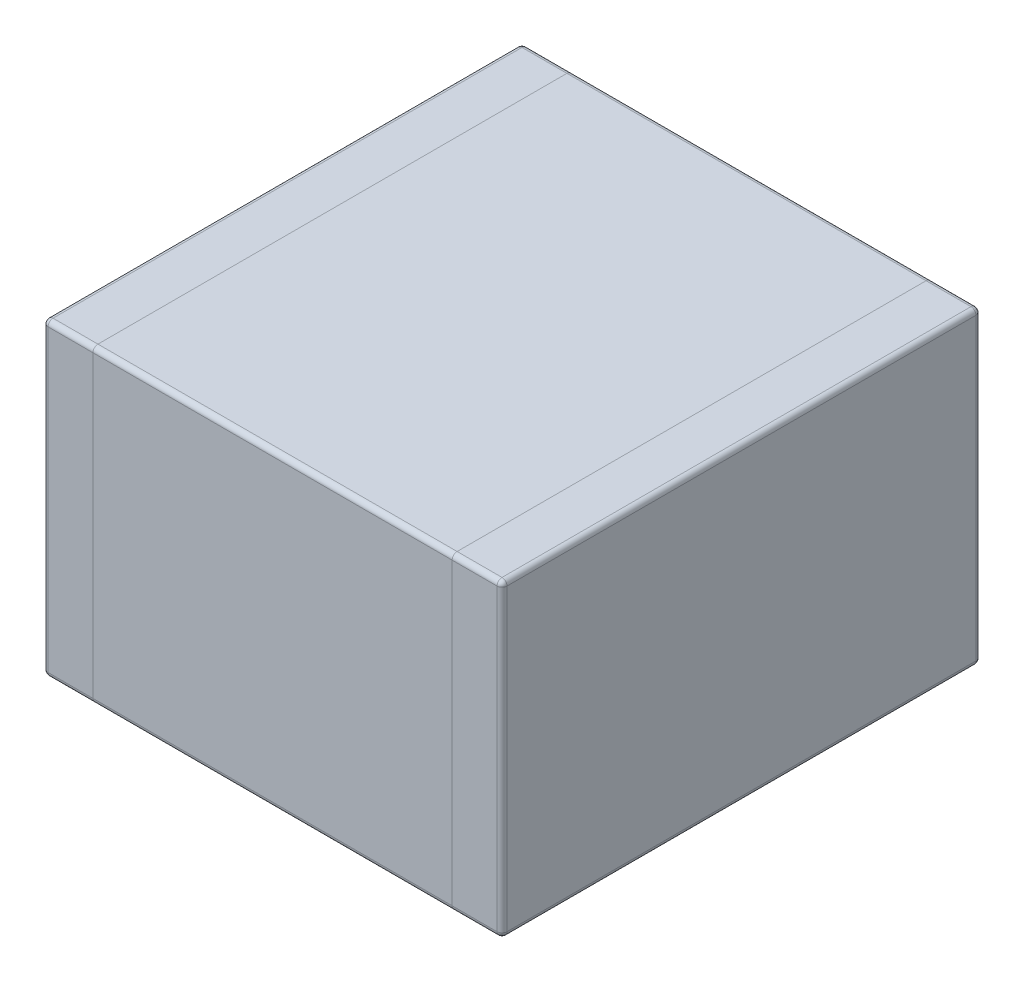
ISO-10303-21;
HEADER;
FILE_DESCRIPTION(('STEP AP214'),'2;1');
FILE_NAME('part.step','',(''),(''),'','','');
FILE_SCHEMA(('AUTOMOTIVE_DESIGN { 1 0 10303 214 1 1 1 1 }'));
ENDSEC;
DATA;
#1=APPLICATION_CONTEXT('core data for automotive mechanical design processes');
#2=APPLICATION_PROTOCOL_DEFINITION('international standard','automotive_design',2000,#1);
#3=PRODUCT_CONTEXT('',#1,'mechanical');
#4=PRODUCT('Part','Part','',(#3));
#5=PRODUCT_RELATED_PRODUCT_CATEGORY('part','',(#4));
#6=PRODUCT_DEFINITION_FORMATION('','',#4);
#7=PRODUCT_DEFINITION_CONTEXT('part definition',#1,'design');
#8=PRODUCT_DEFINITION('design','',#6,#7);
#9=PRODUCT_DEFINITION_SHAPE('','',#8);
#10=(LENGTH_UNIT() NAMED_UNIT(*) SI_UNIT(.MILLI.,.METRE.));
#11=(NAMED_UNIT(*) PLANE_ANGLE_UNIT() SI_UNIT($,.RADIAN.));
#12=(NAMED_UNIT(*) SI_UNIT($,.STERADIAN.) SOLID_ANGLE_UNIT());
#13=UNCERTAINTY_MEASURE_WITH_UNIT(LENGTH_MEASURE(1.E-05),#10,'distance_accuracy_value','');
#14=(GEOMETRIC_REPRESENTATION_CONTEXT(3) GLOBAL_UNCERTAINTY_ASSIGNED_CONTEXT((#13)) GLOBAL_UNIT_ASSIGNED_CONTEXT((#10,
#11,#12)) REPRESENTATION_CONTEXT('',''));
#15=CARTESIAN_POINT('',(0.,0.,0.));
#16=DIRECTION('',(0.,0.,1.));
#17=DIRECTION('',(1.,0.,0.));
#18=AXIS2_PLACEMENT_3D('',#15,#16,#17);
#19=CARTESIAN_POINT('',(2.3,3.1,-2.4));
#20=DIRECTION('',(0.,-1.,0.));
#21=DIRECTION('',(0.,0.,-1.));
#22=AXIS2_PLACEMENT_3D('',#19,#20,#21);
#23=PLANE('',#22);
#24=DIRECTION('',(0.,0.,1.));
#25=VECTOR('',#24,1.);
#26=CARTESIAN_POINT('',(-1.8,3.1,-2.4));
#27=LINE('',#26,#25);
#28=CARTESIAN_POINT('',(-1.8,3.1,-2.35));
#29=VERTEX_POINT('',#28);
#30=CARTESIAN_POINT('',(-1.8,3.1,2.35));
#31=VERTEX_POINT('',#30);
#32=EDGE_CURVE('E11',#29,#31,#27,.T.);
#33=ORIENTED_EDGE('',*,*,#32,.F.);
#34=DIRECTION('',(-1.,0.,0.));
#35=VECTOR('',#34,1.);
#36=CARTESIAN_POINT('',(2.3,3.1,-2.35));
#37=LINE('',#36,#35);
#38=CARTESIAN_POINT('',(-2.25,3.1,-2.35));
#39=VERTEX_POINT('',#38);
#40=EDGE_CURVE('E253',#29,#39,#37,.T.);
#41=ORIENTED_EDGE('',*,*,#40,.T.);
#42=DIRECTION('',(0.,0.,1.));
#43=VECTOR('',#42,1.);
#44=CARTESIAN_POINT('',(-2.25,3.1,-2.4));
#45=LINE('',#44,#43);
#46=CARTESIAN_POINT('',(-2.25,3.1,2.35));
#47=VERTEX_POINT('',#46);
#48=EDGE_CURVE('E256',#39,#47,#45,.T.);
#49=ORIENTED_EDGE('',*,*,#48,.T.);
#50=DIRECTION('',(1.,0.,0.));
#51=VECTOR('',#50,1.);
#52=CARTESIAN_POINT('',(2.3,3.1,2.35));
#53=LINE('',#52,#51);
#54=EDGE_CURVE('E260',#47,#31,#53,.T.);
#55=ORIENTED_EDGE('',*,*,#54,.T.);
#56=EDGE_LOOP('',(#33,#41,#49,#55));
#57=FACE_BOUND('',#56,.T.);
#58=ADVANCED_FACE('F37',(#57),#23,.F.);
#59=DIRECTION('',(0.,0.,-1.));
#60=VECTOR('',#59,1.);
#61=CARTESIAN_POINT('',(1.8,3.1,-2.4));
#62=LINE('',#61,#60);
#63=CARTESIAN_POINT('',(1.8,3.1,2.35));
#64=VERTEX_POINT('',#63);
#65=CARTESIAN_POINT('',(1.8,3.1,-2.35));
#66=VERTEX_POINT('',#65);
#67=EDGE_CURVE('E47',#64,#66,#62,.T.);
#68=ORIENTED_EDGE('',*,*,#67,.F.);
#69=CARTESIAN_POINT('',(2.25,3.1,2.35));
#70=VERTEX_POINT('',#69);
#71=EDGE_CURVE('E259',#64,#70,#53,.T.);
#72=ORIENTED_EDGE('',*,*,#71,.T.);
#73=DIRECTION('',(0.,0.,-1.));
#74=VECTOR('',#73,1.);
#75=CARTESIAN_POINT('',(2.25,3.1,-2.4));
#76=LINE('',#75,#74);
#77=CARTESIAN_POINT('',(2.25,3.1,-2.35));
#78=VERTEX_POINT('',#77);
#79=EDGE_CURVE('E250',#70,#78,#76,.T.);
#80=ORIENTED_EDGE('',*,*,#79,.T.);
#81=EDGE_CURVE('E254',#78,#66,#37,.T.);
#82=ORIENTED_EDGE('',*,*,#81,.T.);
#83=EDGE_LOOP('',(#68,#72,#80,#82));
#84=FACE_BOUND('',#83,.T.);
#85=ADVANCED_FACE('F526',(#84),#23,.F.);
#86=CARTESIAN_POINT('',(2.3,3.05,2.35));
#87=DIRECTION('',(1.,0.,0.));
#88=DIRECTION('',(0.,0.,-1.));
#89=AXIS2_PLACEMENT_3D('',#86,#87,#88);
#90=CYLINDRICAL_SURFACE('',#89,0.05);
#91=DIRECTION('',(1.,0.,0.));
#92=VECTOR('',#91,1.);
#93=CARTESIAN_POINT('',(-2.3,3.05,2.4));
#94=LINE('',#93,#92);
#95=CARTESIAN_POINT('',(-1.8,3.05,2.4));
#96=VERTEX_POINT('',#95);
#97=CARTESIAN_POINT('',(-2.25,3.05,2.4));
#98=VERTEX_POINT('',#97);
#99=EDGE_CURVE('E246',#96,#98,#94,.F.);
#100=ORIENTED_EDGE('',*,*,#99,.F.);
#101=CARTESIAN_POINT('',(-1.8,3.05,2.35));
#102=DIRECTION('',(1.,0.,0.));
#103=DIRECTION('',(0.,0.,-1.));
#104=AXIS2_PLACEMENT_3D('',#101,#102,#103);
#105=CIRCLE('',#104,0.05);
#106=EDGE_CURVE('E354',#96,#31,#105,.F.);
#107=ORIENTED_EDGE('',*,*,#106,.T.);
#108=ORIENTED_EDGE('',*,*,#54,.F.);
#109=CARTESIAN_POINT('',(-2.25,3.05,2.35));
#110=DIRECTION('',(-1.,0.,0.));
#111=DIRECTION('',(0.,-1.,0.));
#112=AXIS2_PLACEMENT_3D('',#109,#110,#111);
#113=CIRCLE('',#112,0.05);
#114=EDGE_CURVE('E330',#47,#98,#113,.F.);
#115=ORIENTED_EDGE('',*,*,#114,.T.);
#116=EDGE_LOOP('',(#100,#107,#108,#115));
#117=FACE_BOUND('',#116,.T.);
#118=ADVANCED_FACE('F483',(#117),#90,.T.);
#119=ORIENTED_EDGE('',*,*,#71,.F.);
#120=CARTESIAN_POINT('',(1.8,3.05,2.35));
#121=DIRECTION('',(-1.,0.,0.));
#122=DIRECTION('',(0.,0.,1.));
#123=AXIS2_PLACEMENT_3D('',#120,#121,#122);
#124=CIRCLE('',#123,0.05);
#125=CARTESIAN_POINT('',(1.8,3.05,2.4));
#126=VERTEX_POINT('',#125);
#127=EDGE_CURVE('E353',#64,#126,#124,.F.);
#128=ORIENTED_EDGE('',*,*,#127,.T.);
#129=CARTESIAN_POINT('',(2.25,3.05,2.4));
#130=VERTEX_POINT('',#129);
#131=EDGE_CURVE('E247',#130,#126,#94,.F.);
#132=ORIENTED_EDGE('',*,*,#131,.F.);
#133=CARTESIAN_POINT('',(2.25,3.05,2.35));
#134=DIRECTION('',(1.,0.,0.));
#135=DIRECTION('',(0.,0.,-1.));
#136=AXIS2_PLACEMENT_3D('',#133,#134,#135);
#137=CIRCLE('',#136,0.05);
#138=EDGE_CURVE('E315',#70,#130,#137,.T.);
#139=ORIENTED_EDGE('',*,*,#138,.F.);
#140=EDGE_LOOP('',(#119,#128,#132,#139));
#141=FACE_BOUND('',#140,.T.);
#142=ADVANCED_FACE('F457',(#141),#90,.T.);
#143=CARTESIAN_POINT('',(-2.3,3.1,2.4));
#144=DIRECTION('',(0.,0.,-1.));
#145=DIRECTION('',(-1.,0.,0.));
#146=AXIS2_PLACEMENT_3D('',#143,#144,#145);
#147=PLANE('',#146);
#148=DIRECTION('',(0.,-1.,0.));
#149=VECTOR('',#148,1.);
#150=CARTESIAN_POINT('',(-1.8,3.1,2.4));
#151=LINE('',#150,#149);
#152=CARTESIAN_POINT('',(-1.8,0.0500000000000001,2.4));
#153=VERTEX_POINT('',#152);
#154=EDGE_CURVE('E349',#96,#153,#151,.T.);
#155=ORIENTED_EDGE('',*,*,#154,.F.);
#156=ORIENTED_EDGE('',*,*,#99,.T.);
#157=DIRECTION('',(0.,-1.,0.));
#158=VECTOR('',#157,1.);
#159=CARTESIAN_POINT('',(-2.25,3.1,2.4));
#160=LINE('',#159,#158);
#161=CARTESIAN_POINT('',(-2.25,0.0500000000000001,2.4));
#162=VERTEX_POINT('',#161);
#163=EDGE_CURVE('E243',#98,#162,#160,.T.);
#164=ORIENTED_EDGE('',*,*,#163,.T.);
#165=DIRECTION('',(1.,0.,0.));
#166=VECTOR('',#165,1.);
#167=CARTESIAN_POINT('',(2.3,0.0500000000000001,2.4));
#168=LINE('',#167,#166);
#169=EDGE_CURVE('E237',#162,#153,#168,.T.);
#170=ORIENTED_EDGE('',*,*,#169,.T.);
#171=EDGE_LOOP('',(#155,#156,#164,#170));
#172=FACE_BOUND('',#171,.T.);
#173=ADVANCED_FACE('F471',(#172),#147,.F.);
#174=DIRECTION('',(0.,1.,0.));
#175=VECTOR('',#174,1.);
#176=CARTESIAN_POINT('',(1.8,3.1,2.4));
#177=LINE('',#176,#175);
#178=CARTESIAN_POINT('',(1.8,0.0500000000000001,2.4));
#179=VERTEX_POINT('',#178);
#180=EDGE_CURVE('E345',#179,#126,#177,.T.);
#181=ORIENTED_EDGE('',*,*,#180,.F.);
#182=CARTESIAN_POINT('',(2.25,0.0500000000000001,2.4));
#183=VERTEX_POINT('',#182);
#184=EDGE_CURVE('E236',#179,#183,#168,.T.);
#185=ORIENTED_EDGE('',*,*,#184,.T.);
#186=DIRECTION('',(0.,-1.,0.));
#187=VECTOR('',#186,1.);
#188=CARTESIAN_POINT('',(2.25,3.1,2.4));
#189=LINE('',#188,#187);
#190=EDGE_CURVE('E240',#183,#130,#189,.F.);
#191=ORIENTED_EDGE('',*,*,#190,.T.);
#192=ORIENTED_EDGE('',*,*,#131,.T.);
#193=EDGE_LOOP('',(#181,#185,#191,#192));
#194=FACE_BOUND('',#193,.T.);
#195=ADVANCED_FACE('F453',(#194),#147,.F.);
#196=CARTESIAN_POINT('',(-2.3,0.0500000000000001,2.35));
#197=DIRECTION('',(-1.,0.,0.));
#198=DIRECTION('',(0.,0.,1.));
#199=AXIS2_PLACEMENT_3D('',#196,#197,#198);
#200=CYLINDRICAL_SURFACE('',#199,0.05);
#201=DIRECTION('',(1.,0.,0.));
#202=VECTOR('',#201,1.);
#203=CARTESIAN_POINT('',(-2.3,0.,2.35));
#204=LINE('',#203,#202);
#205=CARTESIAN_POINT('',(-1.8,0.,2.35));
#206=VERTEX_POINT('',#205);
#207=CARTESIAN_POINT('',(-2.25,0.,2.35));
#208=VERTEX_POINT('',#207);
#209=EDGE_CURVE('E266',#206,#208,#204,.F.);
#210=ORIENTED_EDGE('',*,*,#209,.F.);
#211=CARTESIAN_POINT('',(-1.8,0.0500000000000001,2.35));
#212=DIRECTION('',(1.,0.,0.));
#213=DIRECTION('',(0.,0.,-1.));
#214=AXIS2_PLACEMENT_3D('',#211,#212,#213);
#215=CIRCLE('',#214,0.05);
#216=EDGE_CURVE('E350',#206,#153,#215,.F.);
#217=ORIENTED_EDGE('',*,*,#216,.T.);
#218=ORIENTED_EDGE('',*,*,#169,.F.);
#219=CARTESIAN_POINT('',(-2.25,0.05,2.35));
#220=DIRECTION('',(-1.,0.,0.));
#221=DIRECTION('',(0.,0.,1.));
#222=AXIS2_PLACEMENT_3D('',#219,#220,#221);
#223=CIRCLE('',#222,0.05);
#224=EDGE_CURVE('E321',#162,#208,#223,.F.);
#225=ORIENTED_EDGE('',*,*,#224,.T.);
#226=EDGE_LOOP('',(#210,#217,#218,#225));
#227=FACE_BOUND('',#226,.T.);
#228=ADVANCED_FACE('F509',(#227),#200,.T.);
#229=ORIENTED_EDGE('',*,*,#184,.F.);
#230=CARTESIAN_POINT('',(1.8,0.0500000000000001,2.35));
#231=DIRECTION('',(-1.,0.,0.));
#232=DIRECTION('',(0.,0.,1.));
#233=AXIS2_PLACEMENT_3D('',#230,#231,#232);
#234=CIRCLE('',#233,0.05);
#235=CARTESIAN_POINT('',(1.8,0.,2.35));
#236=VERTEX_POINT('',#235);
#237=EDGE_CURVE('E365',#179,#236,#234,.F.);
#238=ORIENTED_EDGE('',*,*,#237,.T.);
#239=CARTESIAN_POINT('',(2.25,0.,2.35));
#240=VERTEX_POINT('',#239);
#241=EDGE_CURVE('E267',#240,#236,#204,.F.);
#242=ORIENTED_EDGE('',*,*,#241,.F.);
#243=CARTESIAN_POINT('',(2.25,0.0500000000000001,2.35));
#244=DIRECTION('',(1.,0.,0.));
#245=DIRECTION('',(0.,0.,-1.));
#246=AXIS2_PLACEMENT_3D('',#243,#244,#245);
#247=CIRCLE('',#246,0.05);
#248=EDGE_CURVE('E301',#183,#240,#247,.T.);
#249=ORIENTED_EDGE('',*,*,#248,.F.);
#250=EDGE_LOOP('',(#229,#238,#242,#249));
#251=FACE_BOUND('',#250,.T.);
#252=ADVANCED_FACE('F443',(#251),#200,.T.);
#253=CARTESIAN_POINT('',(2.3,0.,-2.4));
#254=DIRECTION('',(0.,-1.,0.));
#255=DIRECTION('',(0.,0.,-1.));
#256=AXIS2_PLACEMENT_3D('',#253,#254,#255);
#257=PLANE('',#256);
#258=DIRECTION('',(-1.,0.,0.));
#259=VECTOR('',#258,1.);
#260=CARTESIAN_POINT('',(2.3,0.,-2.35));
#261=LINE('',#260,#259);
#262=CARTESIAN_POINT('',(-2.25,0.,-2.35));
#263=VERTEX_POINT('',#262);
#264=CARTESIAN_POINT('',(-1.8,0.,-2.35));
#265=VERTEX_POINT('',#264);
#266=EDGE_CURVE('E274',#263,#265,#261,.F.);
#267=ORIENTED_EDGE('',*,*,#266,.T.);
#268=DIRECTION('',(0.,0.,1.));
#269=VECTOR('',#268,1.);
#270=CARTESIAN_POINT('',(-1.8,0.,-2.4));
#271=LINE('',#270,#269);
#272=EDGE_CURVE('E366',#265,#206,#271,.T.);
#273=ORIENTED_EDGE('',*,*,#272,.T.);
#274=ORIENTED_EDGE('',*,*,#209,.T.);
#275=DIRECTION('',(0.,0.,1.));
#276=VECTOR('',#275,1.);
#277=CARTESIAN_POINT('',(-2.25,0.,-2.4));
#278=LINE('',#277,#276);
#279=EDGE_CURVE('E270',#208,#263,#278,.F.);
#280=ORIENTED_EDGE('',*,*,#279,.T.);
#281=EDGE_LOOP('',(#267,#273,#274,#280));
#282=FACE_BOUND('',#281,.T.);
#283=ADVANCED_FACE('F512',(#282),#257,.T.);
#284=ORIENTED_EDGE('',*,*,#241,.T.);
#285=DIRECTION('',(0.,0.,-1.));
#286=VECTOR('',#285,1.);
#287=CARTESIAN_POINT('',(1.8,0.,-2.4));
#288=LINE('',#287,#286);
#289=CARTESIAN_POINT('',(1.8,0.,-2.35));
#290=VERTEX_POINT('',#289);
#291=EDGE_CURVE('E360',#236,#290,#288,.T.);
#292=ORIENTED_EDGE('',*,*,#291,.T.);
#293=CARTESIAN_POINT('',(2.25,0.,-2.35));
#294=VERTEX_POINT('',#293);
#295=EDGE_CURVE('E273',#290,#294,#261,.F.);
#296=ORIENTED_EDGE('',*,*,#295,.T.);
#297=DIRECTION('',(0.,0.,-1.));
#298=VECTOR('',#297,1.);
#299=CARTESIAN_POINT('',(2.25,0.,2.4));
#300=LINE('',#299,#298);
#301=EDGE_CURVE('E263',#294,#240,#300,.F.);
#302=ORIENTED_EDGE('',*,*,#301,.T.);
#303=EDGE_LOOP('',(#284,#292,#296,#302));
#304=FACE_BOUND('',#303,.T.);
#305=ADVANCED_FACE('F387',(#304),#257,.T.);
#306=CARTESIAN_POINT('',(2.3,3.05,-2.35));
#307=DIRECTION('',(-1.,0.,0.));
#308=DIRECTION('',(0.,0.,1.));
#309=AXIS2_PLACEMENT_3D('',#306,#307,#308);
#310=CYLINDRICAL_SURFACE('',#309,0.05);
#311=ORIENTED_EDGE('',*,*,#40,.F.);
#312=CARTESIAN_POINT('',(-1.8,3.05,-2.35));
#313=DIRECTION('',(1.,0.,0.));
#314=DIRECTION('',(0.,0.,-1.));
#315=AXIS2_PLACEMENT_3D('',#312,#313,#314);
#316=CIRCLE('',#315,0.05);
#317=CARTESIAN_POINT('',(-1.8,3.05,-2.4));
#318=VERTEX_POINT('',#317);
#319=EDGE_CURVE('E357',#29,#318,#316,.F.);
#320=ORIENTED_EDGE('',*,*,#319,.T.);
#321=DIRECTION('',(-1.,0.,0.));
#322=VECTOR('',#321,1.);
#323=CARTESIAN_POINT('',(-2.3,3.05,-2.4));
#324=LINE('',#323,#322);
#325=CARTESIAN_POINT('',(-2.25,3.05,-2.4));
#326=VERTEX_POINT('',#325);
#327=EDGE_CURVE('E216',#326,#318,#324,.F.);
#328=ORIENTED_EDGE('',*,*,#327,.F.);
#329=CARTESIAN_POINT('',(-2.25,3.05,-2.35));
#330=DIRECTION('',(-1.,0.,0.));
#331=DIRECTION('',(0.,0.,1.));
#332=AXIS2_PLACEMENT_3D('',#329,#330,#331);
#333=CIRCLE('',#332,0.05);
#334=EDGE_CURVE('E292',#326,#39,#333,.F.);
#335=ORIENTED_EDGE('',*,*,#334,.T.);
#336=EDGE_LOOP('',(#311,#320,#328,#335));
#337=FACE_BOUND('',#336,.T.);
#338=ADVANCED_FACE('F519',(#337),#310,.T.);
#339=CARTESIAN_POINT('',(1.8,3.05,-2.4));
#340=VERTEX_POINT('',#339);
#341=CARTESIAN_POINT('',(2.25,3.05,-2.4));
#342=VERTEX_POINT('',#341);
#343=EDGE_CURVE('E211',#340,#342,#324,.F.);
#344=ORIENTED_EDGE('',*,*,#343,.F.);
#345=CARTESIAN_POINT('',(1.8,3.05,-2.35));
#346=DIRECTION('',(-1.,0.,0.));
#347=DIRECTION('',(0.,0.,1.));
#348=AXIS2_PLACEMENT_3D('',#345,#346,#347);
#349=CIRCLE('',#348,0.05);
#350=EDGE_CURVE('E361',#340,#66,#349,.F.);
#351=ORIENTED_EDGE('',*,*,#350,.T.);
#352=ORIENTED_EDGE('',*,*,#81,.F.);
#353=CARTESIAN_POINT('',(2.25,3.05,-2.35));
#354=DIRECTION('',(1.,0.,0.));
#355=DIRECTION('',(0.,1.,0.));
#356=AXIS2_PLACEMENT_3D('',#353,#354,#355);
#357=CIRCLE('',#356,0.05);
#358=EDGE_CURVE('E196',#342,#78,#357,.T.);
#359=ORIENTED_EDGE('',*,*,#358,.F.);
#360=EDGE_LOOP('',(#344,#351,#352,#359));
#361=FACE_BOUND('',#360,.T.);
#362=ADVANCED_FACE('F422',(#361),#310,.T.);
#363=CARTESIAN_POINT('',(-2.3,0.0500000000000001,-2.35));
#364=DIRECTION('',(1.,0.,0.));
#365=DIRECTION('',(0.,0.,-1.));
#366=AXIS2_PLACEMENT_3D('',#363,#364,#365);
#367=CYLINDRICAL_SURFACE('',#366,0.05);
#368=DIRECTION('',(-1.,0.,0.));
#369=VECTOR('',#368,1.);
#370=CARTESIAN_POINT('',(-2.3,0.0500000000000001,-2.4));
#371=LINE('',#370,#369);
#372=CARTESIAN_POINT('',(-1.8,0.0500000000000001,-2.4));
#373=VERTEX_POINT('',#372);
#374=CARTESIAN_POINT('',(-2.25,0.0500000000000001,-2.4));
#375=VERTEX_POINT('',#374);
#376=EDGE_CURVE('E208',#373,#375,#371,.T.);
#377=ORIENTED_EDGE('',*,*,#376,.F.);
#378=CARTESIAN_POINT('',(-1.8,0.0500000000000001,-2.35));
#379=DIRECTION('',(1.,0.,0.));
#380=DIRECTION('',(0.,0.,-1.));
#381=AXIS2_PLACEMENT_3D('',#378,#379,#380);
#382=CIRCLE('',#381,0.05);
#383=EDGE_CURVE('E370',#373,#265,#382,.F.);
#384=ORIENTED_EDGE('',*,*,#383,.T.);
#385=ORIENTED_EDGE('',*,*,#266,.F.);
#386=CARTESIAN_POINT('',(-2.25,0.0500000000000001,-2.35));
#387=DIRECTION('',(-1.,0.,0.));
#388=DIRECTION('',(0.,0.,1.));
#389=AXIS2_PLACEMENT_3D('',#386,#387,#388);
#390=CIRCLE('',#389,0.05);
#391=EDGE_CURVE('E289',#263,#375,#390,.F.);
#392=ORIENTED_EDGE('',*,*,#391,.T.);
#393=EDGE_LOOP('',(#377,#384,#385,#392));
#394=FACE_BOUND('',#393,.T.);
#395=ADVANCED_FACE('F405',(#394),#367,.T.);
#396=ORIENTED_EDGE('',*,*,#295,.F.);
#397=CARTESIAN_POINT('',(1.8,0.0500000000000001,-2.35));
#398=DIRECTION('',(-1.,0.,0.));
#399=DIRECTION('',(0.,0.,1.));
#400=AXIS2_PLACEMENT_3D('',#397,#398,#399);
#401=CIRCLE('',#400,0.05);
#402=CARTESIAN_POINT('',(1.8,0.0500000000000001,-2.4));
#403=VERTEX_POINT('',#402);
#404=EDGE_CURVE('E41',#290,#403,#401,.F.);
#405=ORIENTED_EDGE('',*,*,#404,.T.);
#406=CARTESIAN_POINT('',(2.25,0.0500000000000001,-2.4));
#407=VERTEX_POINT('',#406);
#408=EDGE_CURVE('E199',#407,#403,#371,.T.);
#409=ORIENTED_EDGE('',*,*,#408,.F.);
#410=CARTESIAN_POINT('',(2.25,0.05,-2.35));
#411=DIRECTION('',(1.,0.,0.));
#412=DIRECTION('',(0.,0.,-1.));
#413=AXIS2_PLACEMENT_3D('',#410,#411,#412);
#414=CIRCLE('',#413,0.05);
#415=EDGE_CURVE('E188',#294,#407,#414,.T.);
#416=ORIENTED_EDGE('',*,*,#415,.F.);
#417=EDGE_LOOP('',(#396,#405,#409,#416));
#418=FACE_BOUND('',#417,.T.);
#419=ADVANCED_FACE('F200',(#418),#367,.T.);
#420=CARTESIAN_POINT('',(-2.3,3.1,-2.4));
#421=DIRECTION('',(0.,0.,1.));
#422=DIRECTION('',(1.,0.,0.));
#423=AXIS2_PLACEMENT_3D('',#420,#421,#422);
#424=PLANE('',#423);
#425=DIRECTION('',(0.,1.,0.));
#426=VECTOR('',#425,1.);
#427=CARTESIAN_POINT('',(-1.8,3.1,-2.4));
#428=LINE('',#427,#426);
#429=EDGE_CURVE('E341',#373,#318,#428,.T.);
#430=ORIENTED_EDGE('',*,*,#429,.F.);
#431=ORIENTED_EDGE('',*,*,#376,.T.);
#432=DIRECTION('',(0.,-1.,0.));
#433=VECTOR('',#432,1.);
#434=CARTESIAN_POINT('',(-2.25,3.1,-2.4));
#435=LINE('',#434,#433);
#436=EDGE_CURVE('E205',#375,#326,#435,.F.);
#437=ORIENTED_EDGE('',*,*,#436,.T.);
#438=ORIENTED_EDGE('',*,*,#327,.T.);
#439=EDGE_LOOP('',(#430,#431,#437,#438));
#440=FACE_BOUND('',#439,.T.);
#441=ADVANCED_FACE('F408',(#440),#424,.F.);
#442=DIRECTION('',(0.,-1.,0.));
#443=VECTOR('',#442,1.);
#444=CARTESIAN_POINT('',(1.8,3.1,-2.4));
#445=LINE('',#444,#443);
#446=EDGE_CURVE('E276',#340,#403,#445,.T.);
#447=ORIENTED_EDGE('',*,*,#446,.F.);
#448=ORIENTED_EDGE('',*,*,#343,.T.);
#449=DIRECTION('',(0.,-1.,0.));
#450=VECTOR('',#449,1.);
#451=CARTESIAN_POINT('',(2.25,3.1,-2.4));
#452=LINE('',#451,#450);
#453=EDGE_CURVE('E180',#342,#407,#452,.T.);
#454=ORIENTED_EDGE('',*,*,#453,.T.);
#455=ORIENTED_EDGE('',*,*,#408,.T.);
#456=EDGE_LOOP('',(#447,#448,#454,#455));
#457=FACE_BOUND('',#456,.T.);
#458=ADVANCED_FACE('F209',(#457),#424,.F.);
#459=CARTESIAN_POINT('',(2.3,3.1,2.4));
#460=DIRECTION('',(-1.,0.,0.));
#461=DIRECTION('',(0.,0.,1.));
#462=AXIS2_PLACEMENT_3D('',#459,#460,#461);
#463=PLANE('',#462);
#464=DIRECTION('',(0.,-1.,0.));
#465=VECTOR('',#464,1.);
#466=CARTESIAN_POINT('',(2.3,3.1,-2.35));
#467=LINE('',#466,#465);
#468=CARTESIAN_POINT('',(2.3,0.0500000000000001,-2.35));
#469=VERTEX_POINT('',#468);
#470=CARTESIAN_POINT('',(2.3,3.05,-2.35));
#471=VERTEX_POINT('',#470);
#472=EDGE_CURVE('E182',#469,#471,#467,.F.);
#473=ORIENTED_EDGE('',*,*,#472,.T.);
#474=DIRECTION('',(0.,0.,-1.));
#475=VECTOR('',#474,1.);
#476=CARTESIAN_POINT('',(2.3,3.05,2.4));
#477=LINE('',#476,#475);
#478=CARTESIAN_POINT('',(2.3,3.05,2.35));
#479=VERTEX_POINT('',#478);
#480=EDGE_CURVE('E225',#471,#479,#477,.F.);
#481=ORIENTED_EDGE('',*,*,#480,.T.);
#482=DIRECTION('',(0.,-1.,0.));
#483=VECTOR('',#482,1.);
#484=CARTESIAN_POINT('',(2.3,3.1,2.35));
#485=LINE('',#484,#483);
#486=CARTESIAN_POINT('',(2.3,0.0500000000000001,2.35));
#487=VERTEX_POINT('',#486);
#488=EDGE_CURVE('E222',#479,#487,#485,.T.);
#489=ORIENTED_EDGE('',*,*,#488,.T.);
#490=DIRECTION('',(0.,0.,-1.));
#491=VECTOR('',#490,1.);
#492=CARTESIAN_POINT('',(2.3,0.0500000000000001,-2.4));
#493=LINE('',#492,#491);
#494=EDGE_CURVE('E220',#487,#469,#493,.T.);
#495=ORIENTED_EDGE('',*,*,#494,.T.);
#496=EDGE_LOOP('',(#473,#481,#489,#495));
#497=FACE_BOUND('',#496,.T.);
#498=ADVANCED_FACE('F434',(#497),#463,.F.);
#499=EDGE_CURVE('E206',#403,#373,#371,.T.);
#500=ORIENTED_EDGE('',*,*,#499,.T.);
#501=ORIENTED_EDGE('',*,*,#429,.T.);
#502=EDGE_CURVE('E214',#318,#340,#324,.F.);
#503=ORIENTED_EDGE('',*,*,#502,.T.);
#504=ORIENTED_EDGE('',*,*,#446,.T.);
#505=EDGE_LOOP('',(#500,#501,#503,#504));
#506=FACE_BOUND('',#505,.T.);
#507=ADVANCED_FACE('F414',(#506),#424,.F.);
#508=CARTESIAN_POINT('',(-2.3,3.1,2.4));
#509=DIRECTION('',(1.,0.,0.));
#510=DIRECTION('',(0.,0.,-1.));
#511=AXIS2_PLACEMENT_3D('',#508,#509,#510);
#512=PLANE('',#511);
#513=DIRECTION('',(0.,-1.,0.));
#514=VECTOR('',#513,1.);
#515=CARTESIAN_POINT('',(-2.3,3.1,2.35));
#516=LINE('',#515,#514);
#517=CARTESIAN_POINT('',(-2.3,0.0500000000000001,2.35));
#518=VERTEX_POINT('',#517);
#519=CARTESIAN_POINT('',(-2.3,3.05,2.35));
#520=VERTEX_POINT('',#519);
#521=EDGE_CURVE('E229',#518,#520,#516,.F.);
#522=ORIENTED_EDGE('',*,*,#521,.T.);
#523=DIRECTION('',(0.,0.,1.));
#524=VECTOR('',#523,1.);
#525=CARTESIAN_POINT('',(-2.3,3.05,2.4));
#526=LINE('',#525,#524);
#527=CARTESIAN_POINT('',(-2.3,3.05,-2.35));
#528=VERTEX_POINT('',#527);
#529=EDGE_CURVE('E234',#520,#528,#526,.F.);
#530=ORIENTED_EDGE('',*,*,#529,.T.);
#531=DIRECTION('',(0.,-1.,0.));
#532=VECTOR('',#531,1.);
#533=CARTESIAN_POINT('',(-2.3,3.1,-2.35));
#534=LINE('',#533,#532);
#535=CARTESIAN_POINT('',(-2.3,0.0500000000000001,-2.35));
#536=VERTEX_POINT('',#535);
#537=EDGE_CURVE('E231',#528,#536,#534,.T.);
#538=ORIENTED_EDGE('',*,*,#537,.T.);
#539=DIRECTION('',(0.,0.,1.));
#540=VECTOR('',#539,1.);
#541=CARTESIAN_POINT('',(-2.3,0.0500000000000001,2.4));
#542=LINE('',#541,#540);
#543=EDGE_CURVE('E227',#536,#518,#542,.T.);
#544=ORIENTED_EDGE('',*,*,#543,.T.);
#545=EDGE_LOOP('',(#522,#530,#538,#544));
#546=FACE_BOUND('',#545,.T.);
#547=ADVANCED_FACE('F491',(#546),#512,.F.);
#548=EDGE_CURVE('E251',#126,#96,#94,.F.);
#549=ORIENTED_EDGE('',*,*,#548,.T.);
#550=ORIENTED_EDGE('',*,*,#154,.T.);
#551=EDGE_CURVE('E241',#153,#179,#168,.T.);
#552=ORIENTED_EDGE('',*,*,#551,.T.);
#553=ORIENTED_EDGE('',*,*,#180,.T.);
#554=EDGE_LOOP('',(#549,#550,#552,#553));
#555=FACE_BOUND('',#554,.T.);
#556=ADVANCED_FACE('F464',(#555),#147,.F.);
#557=EDGE_CURVE('E257',#66,#29,#37,.T.);
#558=ORIENTED_EDGE('',*,*,#557,.T.);
#559=ORIENTED_EDGE('',*,*,#32,.T.);
#560=EDGE_CURVE('E264',#31,#64,#53,.T.);
#561=ORIENTED_EDGE('',*,*,#560,.T.);
#562=ORIENTED_EDGE('',*,*,#67,.T.);
#563=EDGE_LOOP('',(#558,#559,#561,#562));
#564=FACE_BOUND('',#563,.T.);
#565=ADVANCED_FACE('F524',(#564),#23,.F.);
#566=ORIENTED_EDGE('',*,*,#272,.F.);
#567=EDGE_CURVE('E277',#265,#290,#261,.F.);
#568=ORIENTED_EDGE('',*,*,#567,.T.);
#569=ORIENTED_EDGE('',*,*,#291,.F.);
#570=EDGE_CURVE('E271',#236,#206,#204,.F.);
#571=ORIENTED_EDGE('',*,*,#570,.T.);
#572=EDGE_LOOP('',(#566,#568,#569,#571));
#573=FACE_BOUND('',#572,.T.);
#574=ADVANCED_FACE('F399',(#573),#257,.T.);
#575=CARTESIAN_POINT('',(-2.25,3.1,2.35));
#576=DIRECTION('',(0.,-1.,0.));
#577=DIRECTION('',(0.,0.,-1.));
#578=AXIS2_PLACEMENT_3D('',#575,#576,#577);
#579=CYLINDRICAL_SURFACE('',#578,0.05);
#580=CARTESIAN_POINT('',(-2.25,3.05,2.35));
#581=DIRECTION('',(0.,1.,0.));
#582=DIRECTION('',(0.,0.,1.));
#583=AXIS2_PLACEMENT_3D('',#580,#581,#582);
#584=CIRCLE('',#583,0.05);
#585=EDGE_CURVE('E336',#520,#98,#584,.T.);
#586=ORIENTED_EDGE('',*,*,#585,.F.);
#587=ORIENTED_EDGE('',*,*,#521,.F.);
#588=CARTESIAN_POINT('',(-2.25,0.0500000000000001,2.35));
#589=DIRECTION('',(0.,-1.,0.));
#590=DIRECTION('',(0.,0.,-1.));
#591=AXIS2_PLACEMENT_3D('',#588,#589,#590);
#592=CIRCLE('',#591,0.05);
#593=EDGE_CURVE('E333',#162,#518,#592,.T.);
#594=ORIENTED_EDGE('',*,*,#593,.F.);
#595=ORIENTED_EDGE('',*,*,#163,.F.);
#596=EDGE_LOOP('',(#586,#587,#594,#595));
#597=FACE_BOUND('',#596,.T.);
#598=ADVANCED_FACE('F39',(#597),#579,.T.);
#599=CARTESIAN_POINT('',(-2.25,3.05,2.35));
#600=DIRECTION('',(0.,0.,1.));
#601=DIRECTION('',(1.,0.,0.));
#602=AXIS2_PLACEMENT_3D('',#599,#600,#601);
#603=SPHERICAL_SURFACE('',#602,0.05);
#604=CARTESIAN_POINT('',(-2.25,3.05,2.35));
#605=DIRECTION('',(0.,0.,1.));
#606=DIRECTION('',(1.,0.,0.));
#607=AXIS2_PLACEMENT_3D('',#604,#605,#606);
#608=CIRCLE('',#607,0.05);
#609=EDGE_CURVE('E327',#520,#47,#608,.F.);
#610=ORIENTED_EDGE('',*,*,#609,.F.);
#611=ORIENTED_EDGE('',*,*,#585,.T.);
#612=ORIENTED_EDGE('',*,*,#114,.F.);
#613=EDGE_LOOP('',(#610,#611,#612));
#614=FACE_BOUND('',#613,.T.);
#615=ADVANCED_FACE('F480',(#614),#603,.T.);
#616=CARTESIAN_POINT('',(-2.25,0.05,2.35));
#617=DIRECTION('',(0.,0.,1.));
#618=DIRECTION('',(1.,0.,0.));
#619=AXIS2_PLACEMENT_3D('',#616,#617,#618);
#620=SPHERICAL_SURFACE('',#619,0.05);
#621=ORIENTED_EDGE('',*,*,#224,.F.);
#622=ORIENTED_EDGE('',*,*,#593,.T.);
#623=CARTESIAN_POINT('',(-2.25,0.0500000000000001,2.35));
#624=DIRECTION('',(0.,0.,1.));
#625=DIRECTION('',(1.,0.,0.));
#626=AXIS2_PLACEMENT_3D('',#623,#624,#625);
#627=CIRCLE('',#626,0.05);
#628=EDGE_CURVE('E324',#208,#518,#627,.F.);
#629=ORIENTED_EDGE('',*,*,#628,.F.);
#630=EDGE_LOOP('',(#621,#622,#629));
#631=FACE_BOUND('',#630,.T.);
#632=ADVANCED_FACE('F507',(#631),#620,.T.);
#633=ORIENTED_EDGE('',*,*,#106,.F.);
#634=ORIENTED_EDGE('',*,*,#548,.F.);
#635=ORIENTED_EDGE('',*,*,#127,.F.);
#636=ORIENTED_EDGE('',*,*,#560,.F.);
#637=EDGE_LOOP('',(#633,#634,#635,#636));
#638=FACE_BOUND('',#637,.T.);
#639=ADVANCED_FACE('F466',(#638),#90,.T.);
#640=CARTESIAN_POINT('',(-2.25,3.05,-2.4));
#641=DIRECTION('',(0.,0.,1.));
#642=DIRECTION('',(1.,0.,0.));
#643=AXIS2_PLACEMENT_3D('',#640,#641,#642);
#644=CYLINDRICAL_SURFACE('',#643,0.05);
#645=ORIENTED_EDGE('',*,*,#609,.T.);
#646=ORIENTED_EDGE('',*,*,#48,.F.);
#647=CARTESIAN_POINT('',(-2.25,3.05,-2.35));
#648=DIRECTION('',(0.,0.,-1.));
#649=DIRECTION('',(0.,1.,0.));
#650=AXIS2_PLACEMENT_3D('',#647,#648,#649);
#651=CIRCLE('',#650,0.05);
#652=EDGE_CURVE('E312',#528,#39,#651,.T.);
#653=ORIENTED_EDGE('',*,*,#652,.F.);
#654=ORIENTED_EDGE('',*,*,#529,.F.);
#655=EDGE_LOOP('',(#645,#646,#653,#654));
#656=FACE_BOUND('',#655,.T.);
#657=ADVANCED_FACE('F488',(#656),#644,.T.);
#658=CARTESIAN_POINT('',(-2.25,3.1,-2.35));
#659=DIRECTION('',(0.,-1.,0.));
#660=DIRECTION('',(0.,0.,-1.));
#661=AXIS2_PLACEMENT_3D('',#658,#659,#660);
#662=CYLINDRICAL_SURFACE('',#661,0.05);
#663=CARTESIAN_POINT('',(-2.25,0.0500000000000001,-2.35));
#664=DIRECTION('',(0.,-1.,0.));
#665=DIRECTION('',(0.,0.,-1.));
#666=AXIS2_PLACEMENT_3D('',#663,#664,#665);
#667=CIRCLE('',#666,0.05);
#668=EDGE_CURVE('E306',#536,#375,#667,.T.);
#669=ORIENTED_EDGE('',*,*,#668,.F.);
#670=ORIENTED_EDGE('',*,*,#537,.F.);
#671=CARTESIAN_POINT('',(-2.25,3.05,-2.35));
#672=DIRECTION('',(0.,1.,0.));
#673=DIRECTION('',(0.,0.,1.));
#674=AXIS2_PLACEMENT_3D('',#671,#672,#673);
#675=CIRCLE('',#674,0.05);
#676=EDGE_CURVE('E309',#326,#528,#675,.T.);
#677=ORIENTED_EDGE('',*,*,#676,.F.);
#678=ORIENTED_EDGE('',*,*,#436,.F.);
#679=EDGE_LOOP('',(#669,#670,#677,#678));
#680=FACE_BOUND('',#679,.T.);
#681=ADVANCED_FACE('F495',(#680),#662,.T.);
#682=CARTESIAN_POINT('',(-2.25,0.0500000000000001,2.4));
#683=DIRECTION('',(0.,0.,-1.));
#684=DIRECTION('',(-1.,0.,0.));
#685=AXIS2_PLACEMENT_3D('',#682,#683,#684);
#686=CYLINDRICAL_SURFACE('',#685,0.05);
#687=ORIENTED_EDGE('',*,*,#628,.T.);
#688=ORIENTED_EDGE('',*,*,#543,.F.);
#689=CARTESIAN_POINT('',(-2.25,0.05,-2.35));
#690=DIRECTION('',(0.,0.,-1.));
#691=DIRECTION('',(-1.,0.,0.));
#692=AXIS2_PLACEMENT_3D('',#689,#690,#691);
#693=CIRCLE('',#692,0.05);
#694=EDGE_CURVE('E304',#263,#536,#693,.T.);
#695=ORIENTED_EDGE('',*,*,#694,.F.);
#696=ORIENTED_EDGE('',*,*,#279,.F.);
#697=EDGE_LOOP('',(#687,#688,#695,#696));
#698=FACE_BOUND('',#697,.T.);
#699=ADVANCED_FACE('F502',(#698),#686,.T.);
#700=ORIENTED_EDGE('',*,*,#216,.F.);
#701=ORIENTED_EDGE('',*,*,#570,.F.);
#702=ORIENTED_EDGE('',*,*,#237,.F.);
#703=ORIENTED_EDGE('',*,*,#551,.F.);
#704=EDGE_LOOP('',(#700,#701,#702,#703));
#705=FACE_BOUND('',#704,.T.);
#706=ADVANCED_FACE('F511',(#705),#200,.T.);
#707=CARTESIAN_POINT('',(2.25,3.1,2.35));
#708=DIRECTION('',(0.,-1.,0.));
#709=DIRECTION('',(0.,0.,-1.));
#710=AXIS2_PLACEMENT_3D('',#707,#708,#709);
#711=CYLINDRICAL_SURFACE('',#710,0.05);
#712=CARTESIAN_POINT('',(2.25,3.05,2.35));
#713=DIRECTION('',(0.,1.,0.));
#714=DIRECTION('',(0.,0.,1.));
#715=AXIS2_PLACEMENT_3D('',#712,#713,#714);
#716=CIRCLE('',#715,0.05);
#717=EDGE_CURVE('E318',#130,#479,#716,.T.);
#718=ORIENTED_EDGE('',*,*,#717,.F.);
#719=ORIENTED_EDGE('',*,*,#190,.F.);
#720=CARTESIAN_POINT('',(2.25,0.0500000000000001,2.35));
#721=DIRECTION('',(0.,-1.,0.));
#722=DIRECTION('',(0.,0.,-1.));
#723=AXIS2_PLACEMENT_3D('',#720,#721,#722);
#724=CIRCLE('',#723,0.05);
#725=EDGE_CURVE('E298',#487,#183,#724,.T.);
#726=ORIENTED_EDGE('',*,*,#725,.F.);
#727=ORIENTED_EDGE('',*,*,#488,.F.);
#728=EDGE_LOOP('',(#718,#719,#726,#727));
#729=FACE_BOUND('',#728,.T.);
#730=ADVANCED_FACE('F450',(#729),#711,.T.);
#731=CARTESIAN_POINT('',(2.25,3.05,2.35));
#732=DIRECTION('',(0.,0.,1.));
#733=DIRECTION('',(1.,0.,0.));
#734=AXIS2_PLACEMENT_3D('',#731,#732,#733);
#735=SPHERICAL_SURFACE('',#734,0.05);
#736=ORIENTED_EDGE('',*,*,#138,.T.);
#737=ORIENTED_EDGE('',*,*,#717,.T.);
#738=CARTESIAN_POINT('',(2.25,3.05,2.35));
#739=DIRECTION('',(0.,0.,1.));
#740=DIRECTION('',(0.,-1.,0.));
#741=AXIS2_PLACEMENT_3D('',#738,#739,#740);
#742=CIRCLE('',#741,0.05);
#743=EDGE_CURVE('E295',#70,#479,#742,.F.);
#744=ORIENTED_EDGE('',*,*,#743,.F.);
#745=EDGE_LOOP('',(#736,#737,#744));
#746=FACE_BOUND('',#745,.T.);
#747=ADVANCED_FACE('F535',(#746),#735,.T.);
#748=CARTESIAN_POINT('',(-2.25,3.05,-2.35));
#749=DIRECTION('',(0.,0.,1.));
#750=DIRECTION('',(1.,0.,0.));
#751=AXIS2_PLACEMENT_3D('',#748,#749,#750);
#752=SPHERICAL_SURFACE('',#751,0.05);
#753=ORIENTED_EDGE('',*,*,#676,.T.);
#754=ORIENTED_EDGE('',*,*,#652,.T.);
#755=ORIENTED_EDGE('',*,*,#334,.F.);
#756=EDGE_LOOP('',(#753,#754,#755));
#757=FACE_BOUND('',#756,.T.);
#758=ADVANCED_FACE('F537',(#757),#752,.T.);
#759=CARTESIAN_POINT('',(-2.25,0.05,-2.35));
#760=DIRECTION('',(0.,0.,1.));
#761=DIRECTION('',(1.,0.,0.));
#762=AXIS2_PLACEMENT_3D('',#759,#760,#761);
#763=SPHERICAL_SURFACE('',#762,0.05);
#764=ORIENTED_EDGE('',*,*,#694,.T.);
#765=ORIENTED_EDGE('',*,*,#668,.T.);
#766=ORIENTED_EDGE('',*,*,#391,.F.);
#767=EDGE_LOOP('',(#764,#765,#766));
#768=FACE_BOUND('',#767,.T.);
#769=ADVANCED_FACE('F543',(#768),#763,.T.);
#770=CARTESIAN_POINT('',(2.25,0.05,2.35));
#771=DIRECTION('',(0.,0.,1.));
#772=DIRECTION('',(1.,0.,0.));
#773=AXIS2_PLACEMENT_3D('',#770,#771,#772);
#774=SPHERICAL_SURFACE('',#773,0.05);
#775=ORIENTED_EDGE('',*,*,#725,.T.);
#776=ORIENTED_EDGE('',*,*,#248,.T.);
#777=CARTESIAN_POINT('',(2.25,0.05,2.35));
#778=DIRECTION('',(0.,0.,1.));
#779=DIRECTION('',(1.,0.,0.));
#780=AXIS2_PLACEMENT_3D('',#777,#778,#779);
#781=CIRCLE('',#780,0.05);
#782=EDGE_CURVE('E286',#487,#240,#781,.F.);
#783=ORIENTED_EDGE('',*,*,#782,.F.);
#784=EDGE_LOOP('',(#775,#776,#783));
#785=FACE_BOUND('',#784,.T.);
#786=ADVANCED_FACE('F446',(#785),#774,.T.);
#787=CARTESIAN_POINT('',(2.25,3.05,-2.4));
#788=DIRECTION('',(0.,0.,-1.));
#789=DIRECTION('',(-1.,0.,0.));
#790=AXIS2_PLACEMENT_3D('',#787,#788,#789);
#791=CYLINDRICAL_SURFACE('',#790,0.05);
#792=ORIENTED_EDGE('',*,*,#743,.T.);
#793=ORIENTED_EDGE('',*,*,#480,.F.);
#794=CARTESIAN_POINT('',(2.25,3.05,-2.35));
#795=DIRECTION('',(0.,0.,-1.));
#796=DIRECTION('',(-1.,0.,0.));
#797=AXIS2_PLACEMENT_3D('',#794,#795,#796);
#798=CIRCLE('',#797,0.05);
#799=EDGE_CURVE('E283',#78,#471,#798,.T.);
#800=ORIENTED_EDGE('',*,*,#799,.F.);
#801=ORIENTED_EDGE('',*,*,#79,.F.);
#802=EDGE_LOOP('',(#792,#793,#800,#801));
#803=FACE_BOUND('',#802,.T.);
#804=ADVANCED_FACE('F430',(#803),#791,.T.);
#805=ORIENTED_EDGE('',*,*,#319,.F.);
#806=ORIENTED_EDGE('',*,*,#557,.F.);
#807=ORIENTED_EDGE('',*,*,#350,.F.);
#808=ORIENTED_EDGE('',*,*,#502,.F.);
#809=EDGE_LOOP('',(#805,#806,#807,#808));
#810=FACE_BOUND('',#809,.T.);
#811=ADVANCED_FACE('F417',(#810),#310,.T.);
#812=ORIENTED_EDGE('',*,*,#383,.F.);
#813=ORIENTED_EDGE('',*,*,#499,.F.);
#814=ORIENTED_EDGE('',*,*,#404,.F.);
#815=ORIENTED_EDGE('',*,*,#567,.F.);
#816=EDGE_LOOP('',(#812,#813,#814,#815));
#817=FACE_BOUND('',#816,.T.);
#818=ADVANCED_FACE('F396',(#817),#367,.T.);
#819=CARTESIAN_POINT('',(2.25,0.0500000000000001,2.4));
#820=DIRECTION('',(0.,0.,1.));
#821=DIRECTION('',(1.,0.,0.));
#822=AXIS2_PLACEMENT_3D('',#819,#820,#821);
#823=CYLINDRICAL_SURFACE('',#822,0.05);
#824=ORIENTED_EDGE('',*,*,#782,.T.);
#825=ORIENTED_EDGE('',*,*,#301,.F.);
#826=CARTESIAN_POINT('',(2.25,0.0500000000000001,-2.35));
#827=DIRECTION('',(0.,0.,-1.));
#828=DIRECTION('',(-1.,0.,0.));
#829=AXIS2_PLACEMENT_3D('',#826,#827,#828);
#830=CIRCLE('',#829,0.05);
#831=EDGE_CURVE('E192',#469,#294,#830,.T.);
#832=ORIENTED_EDGE('',*,*,#831,.F.);
#833=ORIENTED_EDGE('',*,*,#494,.F.);
#834=EDGE_LOOP('',(#824,#825,#832,#833));
#835=FACE_BOUND('',#834,.T.);
#836=ADVANCED_FACE('F438',(#835),#823,.T.);
#837=CARTESIAN_POINT('',(2.25,3.05,-2.35));
#838=DIRECTION('',(0.,0.,1.));
#839=DIRECTION('',(1.,0.,0.));
#840=AXIS2_PLACEMENT_3D('',#837,#838,#839);
#841=SPHERICAL_SURFACE('',#840,0.05);
#842=ORIENTED_EDGE('',*,*,#358,.T.);
#843=ORIENTED_EDGE('',*,*,#799,.T.);
#844=CARTESIAN_POINT('',(2.25,3.05,-2.35));
#845=DIRECTION('',(0.,1.,0.));
#846=DIRECTION('',(0.,0.,1.));
#847=AXIS2_PLACEMENT_3D('',#844,#845,#846);
#848=CIRCLE('',#847,0.05);
#849=EDGE_CURVE('E185',#342,#471,#848,.F.);
#850=ORIENTED_EDGE('',*,*,#849,.F.);
#851=EDGE_LOOP('',(#842,#843,#850));
#852=FACE_BOUND('',#851,.T.);
#853=ADVANCED_FACE('F426',(#852),#841,.T.);
#854=CARTESIAN_POINT('',(2.25,0.05,-2.35));
#855=DIRECTION('',(0.,0.,1.));
#856=DIRECTION('',(1.,0.,0.));
#857=AXIS2_PLACEMENT_3D('',#854,#855,#856);
#858=SPHERICAL_SURFACE('',#857,0.05);
#859=ORIENTED_EDGE('',*,*,#831,.T.);
#860=ORIENTED_EDGE('',*,*,#415,.T.);
#861=CARTESIAN_POINT('',(2.25,0.0500000000000001,-2.35));
#862=DIRECTION('',(0.,-1.,0.));
#863=DIRECTION('',(0.,0.,-1.));
#864=AXIS2_PLACEMENT_3D('',#861,#862,#863);
#865=CIRCLE('',#864,0.05);
#866=EDGE_CURVE('E176',#469,#407,#865,.F.);
#867=ORIENTED_EDGE('',*,*,#866,.F.);
#868=EDGE_LOOP('',(#859,#860,#867));
#869=FACE_BOUND('',#868,.T.);
#870=ADVANCED_FACE('F190',(#869),#858,.T.);
#871=CARTESIAN_POINT('',(2.25,3.1,-2.35));
#872=DIRECTION('',(0.,-1.,0.));
#873=DIRECTION('',(0.,0.,-1.));
#874=AXIS2_PLACEMENT_3D('',#871,#872,#873);
#875=CYLINDRICAL_SURFACE('',#874,0.05);
#876=ORIENTED_EDGE('',*,*,#849,.T.);
#877=ORIENTED_EDGE('',*,*,#472,.F.);
#878=ORIENTED_EDGE('',*,*,#866,.T.);
#879=ORIENTED_EDGE('',*,*,#453,.F.);
#880=EDGE_LOOP('',(#876,#877,#878,#879));
#881=FACE_BOUND('',#880,.T.);
#882=ADVANCED_FACE('F178',(#881),#875,.T.);
#883=CLOSED_SHELL('',(#58,#85,#118,#142,#173,#195,#228,#252,#283,#305,#338,#362,#395,#419,#441,
#458,#498,#507,#547,#556,#565,#574,#598,#615,#632,#639,#657,#681,#699,#706,#730,#747,#758,#769,
#786,#804,#811,#818,#836,#853,#870,#882));
#884=MANIFOLD_SOLID_BREP('B2',#883);
#885=ADVANCED_BREP_SHAPE_REPRESENTATION('',(#18,#884),#14);
#886=SHAPE_DEFINITION_REPRESENTATION(#9,#885);
ENDSEC;
END-ISO-10303-21;
